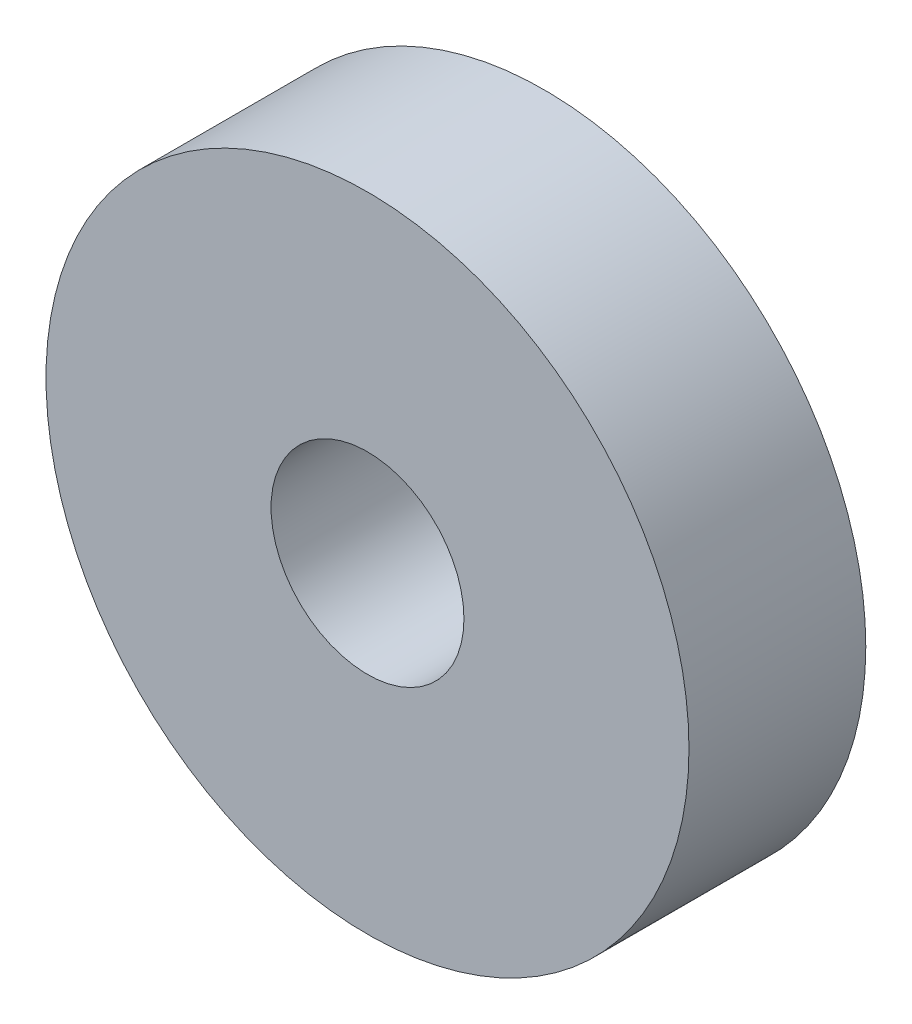
ISO-10303-21;
HEADER;
FILE_DESCRIPTION(('STEP AP214'),'2;1');
FILE_NAME('part.step','',(''),(''),'','','');
FILE_SCHEMA(('AUTOMOTIVE_DESIGN { 1 0 10303 214 1 1 1 1 }'));
ENDSEC;
DATA;
#1=APPLICATION_CONTEXT('core data for automotive mechanical design processes');
#2=APPLICATION_PROTOCOL_DEFINITION('international standard','automotive_design',2000,#1);
#3=PRODUCT_CONTEXT('',#1,'mechanical');
#4=PRODUCT('Part','Part','',(#3));
#5=PRODUCT_RELATED_PRODUCT_CATEGORY('part','',(#4));
#6=PRODUCT_DEFINITION_FORMATION('','',#4);
#7=PRODUCT_DEFINITION_CONTEXT('part definition',#1,'design');
#8=PRODUCT_DEFINITION('design','',#6,#7);
#9=PRODUCT_DEFINITION_SHAPE('','',#8);
#10=(LENGTH_UNIT() NAMED_UNIT(*) SI_UNIT(.MILLI.,.METRE.));
#11=(NAMED_UNIT(*) PLANE_ANGLE_UNIT() SI_UNIT($,.RADIAN.));
#12=(NAMED_UNIT(*) SI_UNIT($,.STERADIAN.) SOLID_ANGLE_UNIT());
#13=UNCERTAINTY_MEASURE_WITH_UNIT(LENGTH_MEASURE(1.E-05),#10,'distance_accuracy_value','');
#14=(GEOMETRIC_REPRESENTATION_CONTEXT(3) GLOBAL_UNCERTAINTY_ASSIGNED_CONTEXT((#13)) GLOBAL_UNIT_ASSIGNED_CONTEXT((#10,
#11,#12)) REPRESENTATION_CONTEXT('',''));
#15=CARTESIAN_POINT('',(0.,0.,0.));
#16=DIRECTION('',(0.,0.,1.));
#17=DIRECTION('',(1.,0.,0.));
#18=AXIS2_PLACEMENT_3D('',#15,#16,#17);
#19=CARTESIAN_POINT('',(12.,17.,11.));
#20=DIRECTION('',(0.,0.,1.));
#21=DIRECTION('',(1.,0.,0.));
#22=AXIS2_PLACEMENT_3D('',#19,#20,#21);
#23=PLANE('',#22);
#24=CARTESIAN_POINT('',(12.,17.,11.));
#25=DIRECTION('',(0.,0.,1.));
#26=DIRECTION('',(1.,0.,0.));
#27=AXIS2_PLACEMENT_3D('',#24,#25,#26);
#28=CIRCLE('',#27,20.);
#29=CARTESIAN_POINT('',(32.,17.,11.));
#30=VERTEX_POINT('',#29);
#31=EDGE_CURVE('E10',#30,#30,#28,.T.);
#32=ORIENTED_EDGE('',*,*,#31,.T.);
#33=EDGE_LOOP('',(#32));
#34=FACE_BOUND('',#33,.T.);
#35=CARTESIAN_POINT('',(12.,17.,11.));
#36=DIRECTION('',(0.,0.,1.));
#37=DIRECTION('',(1.,0.,0.));
#38=AXIS2_PLACEMENT_3D('',#35,#36,#37);
#39=CIRCLE('',#38,6.);
#40=CARTESIAN_POINT('',(18.,17.,11.));
#41=VERTEX_POINT('',#40);
#42=EDGE_CURVE('E50',#41,#41,#39,.T.);
#43=ORIENTED_EDGE('',*,*,#42,.F.);
#44=EDGE_LOOP('',(#43));
#45=FACE_BOUND('',#44,.T.);
#46=ADVANCED_FACE('F39',(#34,#45),#23,.T.);
#47=CARTESIAN_POINT('',(12.,17.,0.));
#48=DIRECTION('',(0.,0.,1.));
#49=DIRECTION('',(1.,0.,0.));
#50=AXIS2_PLACEMENT_3D('',#47,#48,#49);
#51=PLANE('',#50);
#52=CARTESIAN_POINT('',(12.,17.,0.));
#53=DIRECTION('',(0.,0.,1.));
#54=DIRECTION('',(1.,0.,0.));
#55=AXIS2_PLACEMENT_3D('',#52,#53,#54);
#56=CIRCLE('',#55,20.);
#57=CARTESIAN_POINT('',(32.,17.,0.));
#58=VERTEX_POINT('',#57);
#59=EDGE_CURVE('E43',#58,#58,#56,.T.);
#60=ORIENTED_EDGE('',*,*,#59,.F.);
#61=EDGE_LOOP('',(#60));
#62=FACE_BOUND('',#61,.T.);
#63=CARTESIAN_POINT('',(12.,17.,0.));
#64=DIRECTION('',(0.,0.,1.));
#65=DIRECTION('',(1.,0.,0.));
#66=AXIS2_PLACEMENT_3D('',#63,#64,#65);
#67=CIRCLE('',#66,6.);
#68=CARTESIAN_POINT('',(18.,17.,0.));
#69=VERTEX_POINT('',#68);
#70=EDGE_CURVE('E52',#69,#69,#67,.T.);
#71=ORIENTED_EDGE('',*,*,#70,.T.);
#72=EDGE_LOOP('',(#71));
#73=FACE_BOUND('',#72,.T.);
#74=ADVANCED_FACE('F62',(#62,#73),#51,.F.);
#75=CARTESIAN_POINT('',(12.,17.,11.));
#76=DIRECTION('',(0.,0.,-1.));
#77=DIRECTION('',(-1.,0.,0.));
#78=AXIS2_PLACEMENT_3D('',#75,#76,#77);
#79=CYLINDRICAL_SURFACE('',#78,20.);
#80=ORIENTED_EDGE('',*,*,#31,.F.);
#81=EDGE_LOOP('',(#80));
#82=FACE_BOUND('',#81,.T.);
#83=ORIENTED_EDGE('',*,*,#59,.T.);
#84=EDGE_LOOP('',(#83));
#85=FACE_BOUND('',#84,.T.);
#86=ADVANCED_FACE('F41',(#82,#85),#79,.T.);
#87=CARTESIAN_POINT('',(12.,17.,11.));
#88=DIRECTION('',(0.,0.,-1.));
#89=DIRECTION('',(-1.,0.,0.));
#90=AXIS2_PLACEMENT_3D('',#87,#88,#89);
#91=CYLINDRICAL_SURFACE('',#90,6.);
#92=ORIENTED_EDGE('',*,*,#42,.T.);
#93=EDGE_LOOP('',(#92));
#94=FACE_BOUND('',#93,.T.);
#95=ORIENTED_EDGE('',*,*,#70,.F.);
#96=EDGE_LOOP('',(#95));
#97=FACE_BOUND('',#96,.T.);
#98=ADVANCED_FACE('F58',(#94,#97),#91,.F.);
#99=CLOSED_SHELL('',(#46,#74,#86,#98));
#100=MANIFOLD_SOLID_BREP('B2',#99);
#101=ADVANCED_BREP_SHAPE_REPRESENTATION('',(#18,#100),#14);
#102=SHAPE_DEFINITION_REPRESENTATION(#9,#101);
ENDSEC;
END-ISO-10303-21;
